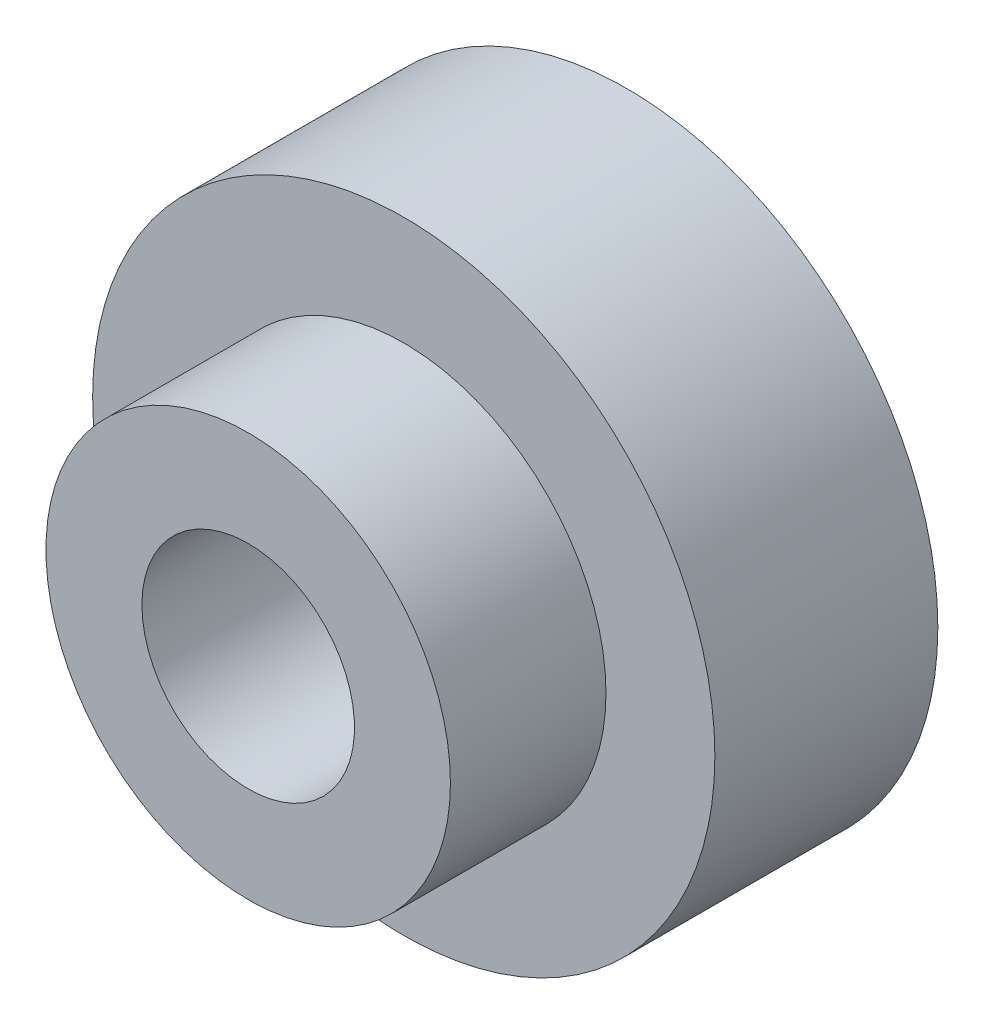
ISO-10303-21;
HEADER;
FILE_DESCRIPTION(('STEP AP214'),'2;1');
FILE_NAME('part.step','',(''),(''),'','','');
FILE_SCHEMA(('AUTOMOTIVE_DESIGN { 1 0 10303 214 1 1 1 1 }'));
ENDSEC;
DATA;
#1=APPLICATION_CONTEXT('core data for automotive mechanical design processes');
#2=APPLICATION_PROTOCOL_DEFINITION('international standard','automotive_design',2000,#1);
#3=PRODUCT_CONTEXT('',#1,'mechanical');
#4=PRODUCT('Part','Part','',(#3));
#5=PRODUCT_RELATED_PRODUCT_CATEGORY('part','',(#4));
#6=PRODUCT_DEFINITION_FORMATION('','',#4);
#7=PRODUCT_DEFINITION_CONTEXT('part definition',#1,'design');
#8=PRODUCT_DEFINITION('design','',#6,#7);
#9=PRODUCT_DEFINITION_SHAPE('','',#8);
#10=(LENGTH_UNIT() NAMED_UNIT(*) SI_UNIT(.MILLI.,.METRE.));
#11=(NAMED_UNIT(*) PLANE_ANGLE_UNIT() SI_UNIT($,.RADIAN.));
#12=(NAMED_UNIT(*) SI_UNIT($,.STERADIAN.) SOLID_ANGLE_UNIT());
#13=UNCERTAINTY_MEASURE_WITH_UNIT(LENGTH_MEASURE(1.E-05),#10,'distance_accuracy_value','');
#14=(GEOMETRIC_REPRESENTATION_CONTEXT(3) GLOBAL_UNCERTAINTY_ASSIGNED_CONTEXT((#13)) GLOBAL_UNIT_ASSIGNED_CONTEXT((#10,
#11,#12)) REPRESENTATION_CONTEXT('',''));
#15=CARTESIAN_POINT('',(0.,0.,0.));
#16=DIRECTION('',(0.,0.,1.));
#17=DIRECTION('',(1.,0.,0.));
#18=AXIS2_PLACEMENT_3D('',#15,#16,#17);
#19=CARTESIAN_POINT('',(0.,0.,4.3));
#20=DIRECTION('',(0.,0.,1.));
#21=DIRECTION('',(1.,0.,0.));
#22=AXIS2_PLACEMENT_3D('',#19,#20,#21);
#23=PLANE('',#22);
#24=CARTESIAN_POINT('',(0.,0.,4.3));
#25=DIRECTION('',(0.,0.,1.));
#26=DIRECTION('',(1.,0.,0.));
#27=AXIS2_PLACEMENT_3D('',#24,#25,#26);
#28=CIRCLE('',#27,6.);
#29=CARTESIAN_POINT('',(-6.,0.,4.3));
#30=VERTEX_POINT('',#29);
#31=EDGE_CURVE('E10',#30,#30,#28,.T.);
#32=ORIENTED_EDGE('',*,*,#31,.T.);
#33=EDGE_LOOP('',(#32));
#34=FACE_BOUND('',#33,.T.);
#35=CARTESIAN_POINT('',(0.,0.,4.3));
#36=DIRECTION('',(0.,0.,1.));
#37=DIRECTION('',(1.,0.,0.));
#38=AXIS2_PLACEMENT_3D('',#35,#36,#37);
#39=CIRCLE('',#38,3.9);
#40=CARTESIAN_POINT('',(3.9,0.,4.3));
#41=VERTEX_POINT('',#40);
#42=EDGE_CURVE('E46',#41,#41,#39,.T.);
#43=ORIENTED_EDGE('',*,*,#42,.F.);
#44=EDGE_LOOP('',(#43));
#45=FACE_BOUND('',#44,.T.);
#46=ADVANCED_FACE('F30',(#34,#45),#23,.T.);
#47=CARTESIAN_POINT('',(0.,0.,0.));
#48=DIRECTION('',(0.,0.,1.));
#49=DIRECTION('',(1.,0.,0.));
#50=AXIS2_PLACEMENT_3D('',#47,#48,#49);
#51=PLANE('',#50);
#52=CARTESIAN_POINT('',(0.,0.,0.));
#53=DIRECTION('',(0.,0.,1.));
#54=DIRECTION('',(1.,0.,0.));
#55=AXIS2_PLACEMENT_3D('',#52,#53,#54);
#56=CIRCLE('',#55,6.);
#57=CARTESIAN_POINT('',(-6.,0.,0.));
#58=VERTEX_POINT('',#57);
#59=EDGE_CURVE('E34',#58,#58,#56,.T.);
#60=ORIENTED_EDGE('',*,*,#59,.F.);
#61=EDGE_LOOP('',(#60));
#62=FACE_BOUND('',#61,.T.);
#63=CARTESIAN_POINT('',(0.,0.,0.));
#64=DIRECTION('',(0.,0.,1.));
#65=DIRECTION('',(1.,0.,0.));
#66=AXIS2_PLACEMENT_3D('',#63,#64,#65);
#67=CIRCLE('',#66,2.05);
#68=CARTESIAN_POINT('',(-2.05,0.,0.));
#69=VERTEX_POINT('',#68);
#70=EDGE_CURVE('E41',#69,#69,#67,.T.);
#71=ORIENTED_EDGE('',*,*,#70,.T.);
#72=EDGE_LOOP('',(#71));
#73=FACE_BOUND('',#72,.T.);
#74=ADVANCED_FACE('F71',(#62,#73),#51,.F.);
#75=CARTESIAN_POINT('',(0.,0.,4.3));
#76=DIRECTION('',(0.,0.,-1.));
#77=DIRECTION('',(-1.,0.,0.));
#78=AXIS2_PLACEMENT_3D('',#75,#76,#77);
#79=CYLINDRICAL_SURFACE('',#78,6.);
#80=CARTESIAN_POINT('',(-6.,0.,4.3));
#81=CARTESIAN_POINT('',(-6.,0.,4.25520833333333));
#82=CARTESIAN_POINT('',(-6.,0.,4.21041666666667));
#83=CARTESIAN_POINT('',(-6.,0.,4.12083333333333));
#84=CARTESIAN_POINT('',(-6.,0.,4.07604166666667));
#85=CARTESIAN_POINT('',(-6.,0.,3.98645833333333));
#86=CARTESIAN_POINT('',(-6.,0.,3.94166666666667));
#87=CARTESIAN_POINT('',(-6.,0.,3.85208333333333));
#88=CARTESIAN_POINT('',(-6.,0.,3.80729166666667));
#89=CARTESIAN_POINT('',(-6.,0.,3.71770833333333));
#90=CARTESIAN_POINT('',(-6.,0.,3.67291666666667));
#91=CARTESIAN_POINT('',(-6.,0.,3.58333333333333));
#92=CARTESIAN_POINT('',(-6.,0.,3.53854166666667));
#93=CARTESIAN_POINT('',(-6.,0.,3.44895833333333));
#94=CARTESIAN_POINT('',(-6.,0.,3.40416666666667));
#95=CARTESIAN_POINT('',(-6.,0.,3.31458333333333));
#96=CARTESIAN_POINT('',(-6.,0.,3.26979166666667));
#97=CARTESIAN_POINT('',(-6.,0.,3.18020833333333));
#98=CARTESIAN_POINT('',(-6.,0.,3.13541666666667));
#99=CARTESIAN_POINT('',(-6.,0.,3.04583333333333));
#100=CARTESIAN_POINT('',(-6.,0.,3.00104166666667));
#101=CARTESIAN_POINT('',(-6.,0.,2.91145833333333));
#102=CARTESIAN_POINT('',(-6.,0.,2.86666666666667));
#103=CARTESIAN_POINT('',(-6.,0.,2.77708333333333));
#104=CARTESIAN_POINT('',(-6.,0.,2.73229166666667));
#105=CARTESIAN_POINT('',(-6.,0.,2.64270833333333));
#106=CARTESIAN_POINT('',(-6.,0.,2.59791666666667));
#107=CARTESIAN_POINT('',(-6.,0.,2.50833333333333));
#108=CARTESIAN_POINT('',(-6.,0.,2.46354166666667));
#109=CARTESIAN_POINT('',(-6.,0.,2.37395833333333));
#110=CARTESIAN_POINT('',(-6.,0.,2.32916666666667));
#111=CARTESIAN_POINT('',(-6.,0.,2.23958333333333));
#112=CARTESIAN_POINT('',(-6.,0.,2.19479166666667));
#113=CARTESIAN_POINT('',(-6.,0.,2.10520833333333));
#114=CARTESIAN_POINT('',(-6.,0.,2.06041666666667));
#115=CARTESIAN_POINT('',(-6.,0.,1.97083333333333));
#116=CARTESIAN_POINT('',(-6.,0.,1.92604166666667));
#117=CARTESIAN_POINT('',(-6.,0.,1.83645833333333));
#118=CARTESIAN_POINT('',(-6.,0.,1.79166666666667));
#119=CARTESIAN_POINT('',(-6.,0.,1.70208333333333));
#120=CARTESIAN_POINT('',(-6.,0.,1.65729166666667));
#121=CARTESIAN_POINT('',(-6.,0.,1.56770833333333));
#122=CARTESIAN_POINT('',(-6.,0.,1.52291666666667));
#123=CARTESIAN_POINT('',(-6.,0.,1.43333333333333));
#124=CARTESIAN_POINT('',(-6.,0.,1.38854166666667));
#125=CARTESIAN_POINT('',(-6.,0.,1.29895833333333));
#126=CARTESIAN_POINT('',(-6.,0.,1.25416666666667));
#127=CARTESIAN_POINT('',(-6.,0.,1.16458333333333));
#128=CARTESIAN_POINT('',(-6.,0.,1.11979166666667));
#129=CARTESIAN_POINT('',(-6.,0.,1.03020833333333));
#130=CARTESIAN_POINT('',(-6.,0.,0.985416666666665));
#131=CARTESIAN_POINT('',(-6.,0.,0.895833333333332));
#132=CARTESIAN_POINT('',(-6.,0.,0.851041666666665));
#133=CARTESIAN_POINT('',(-6.,0.,0.761458333333332));
#134=CARTESIAN_POINT('',(-6.,0.,0.716666666666665));
#135=CARTESIAN_POINT('',(-6.,0.,0.627083333333332));
#136=CARTESIAN_POINT('',(-6.,0.,0.582291666666665));
#137=CARTESIAN_POINT('',(-6.,0.,0.492708333333332));
#138=CARTESIAN_POINT('',(-6.,0.,0.447916666666665));
#139=CARTESIAN_POINT('',(-6.,0.,0.358333333333332));
#140=CARTESIAN_POINT('',(-6.,0.,0.313541666666666));
#141=CARTESIAN_POINT('',(-6.,0.,0.223958333333332));
#142=CARTESIAN_POINT('',(-6.,0.,0.179166666666666));
#143=CARTESIAN_POINT('',(-6.,0.,0.0895833333333324));
#144=CARTESIAN_POINT('',(-6.,0.,0.0447916666666658));
#145=CARTESIAN_POINT('',(-6.,0.,0.));
#146=B_SPLINE_CURVE_WITH_KNOTS('',3,(#80,#81,#82,#83,#84,#85,#86,#87,#88,#89,#90,#91,#92,#93,
#94,#95,#96,#97,#98,#99,#100,#101,#102,#103,#104,#105,#106,#107,#108,#109,#110,#111,#112,#113,
#114,#115,#116,#117,#118,#119,#120,#121,#122,#123,#124,#125,#126,#127,#128,#129,#130,#131,#132,
#133,#134,#135,#136,#137,#138,#139,#140,#141,#142,#143,#144,#145),.UNSPECIFIED.,.F.,.F.,(4,2,2,
2,2,2,2,2,2,2,2,2,2,2,2,2,2,2,2,2,2,2,2,2,2,2,2,2,2,2,2,2,4),(0.,0.134375000000001,
0.268750000000001,0.403125000000001,0.537500000000001,0.671875000000001,0.806250000000001,
0.940625,1.075,1.209375,1.34375,1.478125,1.6125,1.746875,1.88125,2.015625,2.15,2.284375,2.41875,
2.553125,2.6875,2.821875,2.95625,3.090625,3.225,3.359375,3.49375,3.628125,3.7625,3.896875,
4.03125,4.165625,4.3),.UNSPECIFIED.);
#147=EDGE_CURVE('BSEAM32',#30,#58,#146,.T.);
#148=ORIENTED_EDGE('',*,*,#31,.F.);
#149=ORIENTED_EDGE('',*,*,#59,.T.);
#150=ORIENTED_EDGE('',*,*,#147,.T.);
#151=ORIENTED_EDGE('',*,*,#147,.F.);
#152=EDGE_LOOP('',(#148,#150,#149,#151));
#153=FACE_BOUND('',#152,.T.);
#154=ADVANCED_FACE('F32',(#153),#79,.T.);
#155=CARTESIAN_POINT('',(0.,0.,4.3));
#156=DIRECTION('',(0.,0.,-1.));
#157=DIRECTION('',(-1.,0.,0.));
#158=AXIS2_PLACEMENT_3D('',#155,#156,#157);
#159=CYLINDRICAL_SURFACE('',#158,2.05);
#160=CARTESIAN_POINT('',(0.,0.,7.3));
#161=DIRECTION('',(0.,0.,1.));
#162=DIRECTION('',(1.,0.,0.));
#163=AXIS2_PLACEMENT_3D('',#160,#161,#162);
#164=CIRCLE('',#163,2.05);
#165=CARTESIAN_POINT('',(-2.05,0.,7.3));
#166=VERTEX_POINT('',#165);
#167=EDGE_CURVE('E49',#166,#166,#164,.T.);
#168=CARTESIAN_POINT('',(-2.05,0.,0.));
#169=CARTESIAN_POINT('',(-2.05,0.,0.0760416666666659));
#170=CARTESIAN_POINT('',(-2.05,0.,0.152083333333333));
#171=CARTESIAN_POINT('',(-2.05,0.,0.304166666666666));
#172=CARTESIAN_POINT('',(-2.05,0.,0.380208333333332));
#173=CARTESIAN_POINT('',(-2.05,0.,0.532291666666665));
#174=CARTESIAN_POINT('',(-2.05,0.,0.608333333333332));
#175=CARTESIAN_POINT('',(-2.05,0.,0.760416666666665));
#176=CARTESIAN_POINT('',(-2.05,0.,0.836458333333332));
#177=CARTESIAN_POINT('',(-2.05,0.,0.988541666666666));
#178=CARTESIAN_POINT('',(-2.05,0.,1.06458333333333));
#179=CARTESIAN_POINT('',(-2.05,0.,1.21666666666667));
#180=CARTESIAN_POINT('',(-2.05,0.,1.29270833333333));
#181=CARTESIAN_POINT('',(-2.05,0.,1.44479166666667));
#182=CARTESIAN_POINT('',(-2.05,0.,1.52083333333333));
#183=CARTESIAN_POINT('',(-2.05,0.,1.67291666666667));
#184=CARTESIAN_POINT('',(-2.05,0.,1.74895833333333));
#185=CARTESIAN_POINT('',(-2.05,0.,1.90104166666667));
#186=CARTESIAN_POINT('',(-2.05,0.,1.97708333333333));
#187=CARTESIAN_POINT('',(-2.05,0.,2.12916666666667));
#188=CARTESIAN_POINT('',(-2.05,0.,2.20520833333333));
#189=CARTESIAN_POINT('',(-2.05,0.,2.35729166666667));
#190=CARTESIAN_POINT('',(-2.05,0.,2.43333333333333));
#191=CARTESIAN_POINT('',(-2.05,0.,2.58541666666667));
#192=CARTESIAN_POINT('',(-2.05,0.,2.66145833333333));
#193=CARTESIAN_POINT('',(-2.05,0.,2.81354166666667));
#194=CARTESIAN_POINT('',(-2.05,0.,2.88958333333333));
#195=CARTESIAN_POINT('',(-2.05,0.,3.04166666666667));
#196=CARTESIAN_POINT('',(-2.05,0.,3.11770833333333));
#197=CARTESIAN_POINT('',(-2.05,0.,3.26979166666667));
#198=CARTESIAN_POINT('',(-2.05,0.,3.34583333333333));
#199=CARTESIAN_POINT('',(-2.05,0.,3.49791666666667));
#200=CARTESIAN_POINT('',(-2.05,0.,3.57395833333333));
#201=CARTESIAN_POINT('',(-2.05,0.,3.72604166666667));
#202=CARTESIAN_POINT('',(-2.05,0.,3.80208333333333));
#203=CARTESIAN_POINT('',(-2.05,0.,3.95416666666667));
#204=CARTESIAN_POINT('',(-2.05,0.,4.03020833333333));
#205=CARTESIAN_POINT('',(-2.05,0.,4.18229166666667));
#206=CARTESIAN_POINT('',(-2.05,0.,4.25833333333333));
#207=CARTESIAN_POINT('',(-2.05,0.,4.41041666666667));
#208=CARTESIAN_POINT('',(-2.05,0.,4.48645833333333));
#209=CARTESIAN_POINT('',(-2.05,0.,4.63854166666667));
#210=CARTESIAN_POINT('',(-2.05,0.,4.71458333333333));
#211=CARTESIAN_POINT('',(-2.05,0.,4.86666666666667));
#212=CARTESIAN_POINT('',(-2.05,0.,4.94270833333333));
#213=CARTESIAN_POINT('',(-2.05,0.,5.09479166666667));
#214=CARTESIAN_POINT('',(-2.05,0.,5.17083333333333));
#215=CARTESIAN_POINT('',(-2.05,0.,5.32291666666667));
#216=CARTESIAN_POINT('',(-2.05,0.,5.39895833333333));
#217=CARTESIAN_POINT('',(-2.05,0.,5.55104166666667));
#218=CARTESIAN_POINT('',(-2.05,0.,5.62708333333333));
#219=CARTESIAN_POINT('',(-2.05,0.,5.77916666666667));
#220=CARTESIAN_POINT('',(-2.05,0.,5.85520833333333));
#221=CARTESIAN_POINT('',(-2.05,0.,6.00729166666667));
#222=CARTESIAN_POINT('',(-2.05,0.,6.08333333333333));
#223=CARTESIAN_POINT('',(-2.05,0.,6.23541666666667));
#224=CARTESIAN_POINT('',(-2.05,0.,6.31145833333333));
#225=CARTESIAN_POINT('',(-2.05,0.,6.46354166666667));
#226=CARTESIAN_POINT('',(-2.05,0.,6.53958333333333));
#227=CARTESIAN_POINT('',(-2.05,0.,6.69166666666667));
#228=CARTESIAN_POINT('',(-2.05,0.,6.76770833333333));
#229=CARTESIAN_POINT('',(-2.05,0.,6.91979166666667));
#230=CARTESIAN_POINT('',(-2.05,0.,6.99583333333333));
#231=CARTESIAN_POINT('',(-2.05,0.,7.14791666666667));
#232=CARTESIAN_POINT('',(-2.05,0.,7.22395833333333));
#233=CARTESIAN_POINT('',(-2.05,0.,7.3));
#234=B_SPLINE_CURVE_WITH_KNOTS('',3,(#168,#169,#170,#171,#172,#173,#174,#175,#176,#177,#178,
#179,#180,#181,#182,#183,#184,#185,#186,#187,#188,#189,#190,#191,#192,#193,#194,#195,#196,#197,
#198,#199,#200,#201,#202,#203,#204,#205,#206,#207,#208,#209,#210,#211,#212,#213,#214,#215,#216,
#217,#218,#219,#220,#221,#222,#223,#224,#225,#226,#227,#228,#229,#230,#231,#232,#233),
.UNSPECIFIED.,.F.,.F.,(4,2,2,2,2,2,2,2,2,2,2,2,2,2,2,2,2,2,2,2,2,2,2,2,2,2,2,2,2,2,2,2,4),(0.,
0.228125,0.45625,0.684375,0.9125,1.140625,1.36875,1.596875,1.825,2.053125,2.28125,2.509375,
2.7375,2.965625,3.19375,3.421875,3.65,3.878125,4.10625,4.334375,4.5625,4.790625,5.01875,
5.246875,5.475,5.703125,5.93125,6.159375,6.3875,6.615625,6.84375,7.071875,7.3),.UNSPECIFIED.);
#235=EDGE_CURVE('BSEAM55',#69,#166,#234,.T.);
#236=ORIENTED_EDGE('',*,*,#70,.F.);
#237=ORIENTED_EDGE('',*,*,#167,.T.);
#238=ORIENTED_EDGE('',*,*,#235,.T.);
#239=ORIENTED_EDGE('',*,*,#235,.F.);
#240=EDGE_LOOP('',(#236,#238,#237,#239));
#241=FACE_BOUND('',#240,.T.);
#242=ADVANCED_FACE('F55',(#241),#159,.F.);
#243=CARTESIAN_POINT('',(0.,0.,7.3));
#244=DIRECTION('',(0.,0.,1.));
#245=DIRECTION('',(1.,0.,0.));
#246=AXIS2_PLACEMENT_3D('',#243,#244,#245);
#247=PLANE('',#246);
#248=CARTESIAN_POINT('',(0.,0.,7.3));
#249=DIRECTION('',(0.,0.,1.));
#250=DIRECTION('',(1.,0.,0.));
#251=AXIS2_PLACEMENT_3D('',#248,#249,#250);
#252=CIRCLE('',#251,3.9);
#253=CARTESIAN_POINT('',(3.9,0.,7.3));
#254=VERTEX_POINT('',#253);
#255=EDGE_CURVE('E45',#254,#254,#252,.T.);
#256=ORIENTED_EDGE('',*,*,#255,.T.);
#257=EDGE_LOOP('',(#256));
#258=FACE_BOUND('',#257,.T.);
#259=ORIENTED_EDGE('',*,*,#167,.F.);
#260=EDGE_LOOP('',(#259));
#261=FACE_BOUND('',#260,.T.);
#262=ADVANCED_FACE('F57',(#258,#261),#247,.T.);
#263=CARTESIAN_POINT('',(0.,0.,7.3));
#264=DIRECTION('',(0.,0.,-1.));
#265=DIRECTION('',(-1.,0.,0.));
#266=AXIS2_PLACEMENT_3D('',#263,#264,#265);
#267=CYLINDRICAL_SURFACE('',#266,3.9);
#268=ORIENTED_EDGE('',*,*,#255,.F.);
#269=EDGE_LOOP('',(#268));
#270=FACE_BOUND('',#269,.T.);
#271=ORIENTED_EDGE('',*,*,#42,.T.);
#272=EDGE_LOOP('',(#271));
#273=FACE_BOUND('',#272,.T.);
#274=ADVANCED_FACE('F59',(#270,#273),#267,.T.);
#275=CLOSED_SHELL('',(#46,#74,#154,#242,#262,#274));
#276=MANIFOLD_SOLID_BREP('B2',#275);
#277=ADVANCED_BREP_SHAPE_REPRESENTATION('',(#18,#276),#14);
#278=SHAPE_DEFINITION_REPRESENTATION(#9,#277);
ENDSEC;
END-ISO-10303-21;
